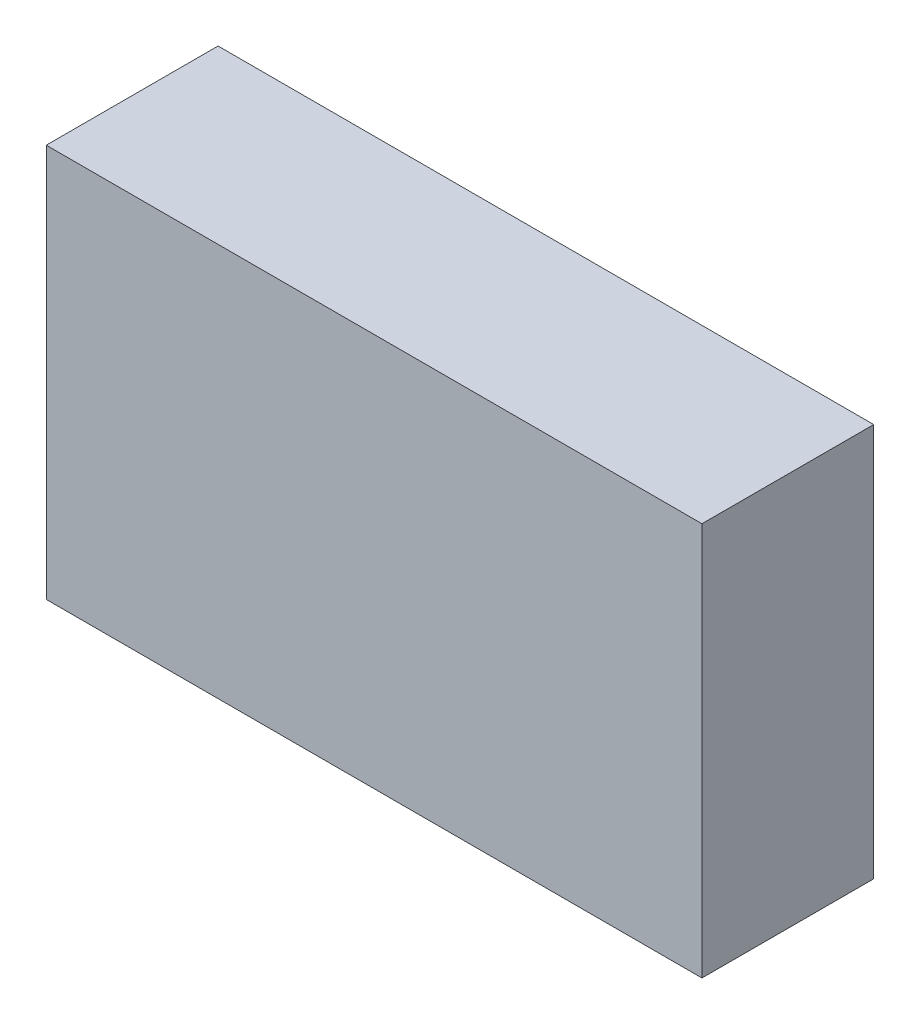
ISO-10303-21;
HEADER;
FILE_DESCRIPTION(('STEP AP214'),'2;1');
FILE_NAME('part.step','',(''),(''),'','','');
FILE_SCHEMA(('AUTOMOTIVE_DESIGN { 1 0 10303 214 1 1 1 1 }'));
ENDSEC;
DATA;
#1=APPLICATION_CONTEXT('core data for automotive mechanical design processes');
#2=APPLICATION_PROTOCOL_DEFINITION('international standard','automotive_design',2000,#1);
#3=PRODUCT_CONTEXT('',#1,'mechanical');
#4=PRODUCT('Part','Part','',(#3));
#5=PRODUCT_RELATED_PRODUCT_CATEGORY('part','',(#4));
#6=PRODUCT_DEFINITION_FORMATION('','',#4);
#7=PRODUCT_DEFINITION_CONTEXT('part definition',#1,'design');
#8=PRODUCT_DEFINITION('design','',#6,#7);
#9=PRODUCT_DEFINITION_SHAPE('','',#8);
#10=(LENGTH_UNIT() NAMED_UNIT(*) SI_UNIT(.MILLI.,.METRE.));
#11=(NAMED_UNIT(*) PLANE_ANGLE_UNIT() SI_UNIT($,.RADIAN.));
#12=(NAMED_UNIT(*) SI_UNIT($,.STERADIAN.) SOLID_ANGLE_UNIT());
#13=UNCERTAINTY_MEASURE_WITH_UNIT(LENGTH_MEASURE(1.E-05),#10,'distance_accuracy_value','');
#14=(GEOMETRIC_REPRESENTATION_CONTEXT(3) GLOBAL_UNCERTAINTY_ASSIGNED_CONTEXT((#13)) GLOBAL_UNIT_ASSIGNED_CONTEXT((#10,
#11,#12)) REPRESENTATION_CONTEXT('',''));
#15=CARTESIAN_POINT('',(0.,0.,0.));
#16=DIRECTION('',(0.,0.,1.));
#17=DIRECTION('',(1.,0.,0.));
#18=AXIS2_PLACEMENT_3D('',#15,#16,#17);
#19=CARTESIAN_POINT('',(75.,45.,39.3));
#20=DIRECTION('',(-1.,0.,0.));
#21=DIRECTION('',(0.,0.,1.));
#22=AXIS2_PLACEMENT_3D('',#19,#20,#21);
#23=PLANE('',#22);
#24=DIRECTION('',(0.,1.,0.));
#25=VECTOR('',#24,1.);
#26=CARTESIAN_POINT('',(75.,45.,0.));
#27=LINE('',#26,#25);
#28=CARTESIAN_POINT('',(75.,-45.,0.));
#29=VERTEX_POINT('',#28);
#30=CARTESIAN_POINT('',(75.,45.,0.));
#31=VERTEX_POINT('',#30);
#32=EDGE_CURVE('E102',#29,#31,#27,.T.);
#33=ORIENTED_EDGE('',*,*,#32,.T.);
#34=DIRECTION('',(0.,0.,-1.));
#35=VECTOR('',#34,1.);
#36=CARTESIAN_POINT('',(75.,45.,39.3));
#37=LINE('',#36,#35);
#38=CARTESIAN_POINT('',(75.,45.,39.3));
#39=VERTEX_POINT('',#38);
#40=EDGE_CURVE('E11',#39,#31,#37,.T.);
#41=ORIENTED_EDGE('',*,*,#40,.F.);
#42=DIRECTION('',(0.,1.,0.));
#43=VECTOR('',#42,1.);
#44=CARTESIAN_POINT('',(75.,45.,39.3));
#45=LINE('',#44,#43);
#46=CARTESIAN_POINT('',(75.,-45.,39.3));
#47=VERTEX_POINT('',#46);
#48=EDGE_CURVE('E90',#47,#39,#45,.T.);
#49=ORIENTED_EDGE('',*,*,#48,.F.);
#50=DIRECTION('',(0.,0.,-1.));
#51=VECTOR('',#50,1.);
#52=CARTESIAN_POINT('',(75.,-45.,39.3));
#53=LINE('',#52,#51);
#54=EDGE_CURVE('E98',#47,#29,#53,.T.);
#55=ORIENTED_EDGE('',*,*,#54,.T.);
#56=EDGE_LOOP('',(#33,#41,#49,#55));
#57=FACE_BOUND('',#56,.T.);
#58=ADVANCED_FACE('F39',(#57),#23,.F.);
#59=CARTESIAN_POINT('',(-75.,45.,39.3));
#60=DIRECTION('',(0.,-1.,0.));
#61=DIRECTION('',(0.,0.,-1.));
#62=AXIS2_PLACEMENT_3D('',#59,#60,#61);
#63=PLANE('',#62);
#64=DIRECTION('',(-1.,0.,0.));
#65=VECTOR('',#64,1.);
#66=CARTESIAN_POINT('',(-75.,45.,0.));
#67=LINE('',#66,#65);
#68=CARTESIAN_POINT('',(-75.,45.,0.));
#69=VERTEX_POINT('',#68);
#70=EDGE_CURVE('E94',#31,#69,#67,.T.);
#71=ORIENTED_EDGE('',*,*,#70,.T.);
#72=DIRECTION('',(0.,0.,-1.));
#73=VECTOR('',#72,1.);
#74=CARTESIAN_POINT('',(-75.,45.,39.3));
#75=LINE('',#74,#73);
#76=CARTESIAN_POINT('',(-75.,45.,39.3));
#77=VERTEX_POINT('',#76);
#78=EDGE_CURVE('E47',#77,#69,#75,.T.);
#79=ORIENTED_EDGE('',*,*,#78,.F.);
#80=DIRECTION('',(-1.,0.,0.));
#81=VECTOR('',#80,1.);
#82=CARTESIAN_POINT('',(-75.,45.,39.3));
#83=LINE('',#82,#81);
#84=EDGE_CURVE('E85',#39,#77,#83,.T.);
#85=ORIENTED_EDGE('',*,*,#84,.F.);
#86=ORIENTED_EDGE('',*,*,#40,.T.);
#87=EDGE_LOOP('',(#71,#79,#85,#86));
#88=FACE_BOUND('',#87,.T.);
#89=ADVANCED_FACE('F93',(#88),#63,.F.);
#90=CARTESIAN_POINT('',(-75.,45.,39.3));
#91=DIRECTION('',(1.,0.,0.));
#92=DIRECTION('',(0.,1.,0.));
#93=AXIS2_PLACEMENT_3D('',#90,#91,#92);
#94=PLANE('',#93);
#95=DIRECTION('',(0.,-1.,0.));
#96=VECTOR('',#95,1.);
#97=CARTESIAN_POINT('',(-75.,45.,0.));
#98=LINE('',#97,#96);
#99=CARTESIAN_POINT('',(-75.,-45.,0.));
#100=VERTEX_POINT('',#99);
#101=EDGE_CURVE('E72',#69,#100,#98,.T.);
#102=ORIENTED_EDGE('',*,*,#101,.T.);
#103=DIRECTION('',(0.,0.,-1.));
#104=VECTOR('',#103,1.);
#105=CARTESIAN_POINT('',(-75.,-45.,39.3));
#106=LINE('',#105,#104);
#107=CARTESIAN_POINT('',(-75.,-45.,39.3));
#108=VERTEX_POINT('',#107);
#109=EDGE_CURVE('E95',#108,#100,#106,.T.);
#110=ORIENTED_EDGE('',*,*,#109,.F.);
#111=DIRECTION('',(0.,-1.,0.));
#112=VECTOR('',#111,1.);
#113=CARTESIAN_POINT('',(-75.,45.,39.3));
#114=LINE('',#113,#112);
#115=EDGE_CURVE('E88',#77,#108,#114,.T.);
#116=ORIENTED_EDGE('',*,*,#115,.F.);
#117=ORIENTED_EDGE('',*,*,#78,.T.);
#118=EDGE_LOOP('',(#102,#110,#116,#117));
#119=FACE_BOUND('',#118,.T.);
#120=ADVANCED_FACE('F96',(#119),#94,.F.);
#121=CARTESIAN_POINT('',(-75.,-45.,39.3));
#122=DIRECTION('',(0.,1.,0.));
#123=DIRECTION('',(0.,0.,1.));
#124=AXIS2_PLACEMENT_3D('',#121,#122,#123);
#125=PLANE('',#124);
#126=DIRECTION('',(1.,0.,0.));
#127=VECTOR('',#126,1.);
#128=CARTESIAN_POINT('',(-75.,-45.,0.));
#129=LINE('',#128,#127);
#130=EDGE_CURVE('E78',#100,#29,#129,.T.);
#131=ORIENTED_EDGE('',*,*,#130,.T.);
#132=ORIENTED_EDGE('',*,*,#54,.F.);
#133=DIRECTION('',(1.,0.,0.));
#134=VECTOR('',#133,1.);
#135=CARTESIAN_POINT('',(-75.,-45.,39.3));
#136=LINE('',#135,#134);
#137=EDGE_CURVE('E55',#108,#47,#136,.T.);
#138=ORIENTED_EDGE('',*,*,#137,.F.);
#139=ORIENTED_EDGE('',*,*,#109,.T.);
#140=EDGE_LOOP('',(#131,#132,#138,#139));
#141=FACE_BOUND('',#140,.T.);
#142=ADVANCED_FACE('F109',(#141),#125,.F.);
#143=CARTESIAN_POINT('',(0.,0.,39.3));
#144=DIRECTION('',(0.,0.,1.));
#145=DIRECTION('',(1.,0.,0.));
#146=AXIS2_PLACEMENT_3D('',#143,#144,#145);
#147=PLANE('',#146);
#148=ORIENTED_EDGE('',*,*,#48,.T.);
#149=ORIENTED_EDGE('',*,*,#84,.T.);
#150=ORIENTED_EDGE('',*,*,#115,.T.);
#151=ORIENTED_EDGE('',*,*,#137,.T.);
#152=EDGE_LOOP('',(#148,#149,#150,#151));
#153=FACE_BOUND('',#152,.T.);
#154=ADVANCED_FACE('F86',(#153),#147,.T.);
#155=CARTESIAN_POINT('',(0.,0.,0.));
#156=DIRECTION('',(0.,0.,1.));
#157=DIRECTION('',(1.,0.,0.));
#158=AXIS2_PLACEMENT_3D('',#155,#156,#157);
#159=PLANE('',#158);
#160=ORIENTED_EDGE('',*,*,#32,.F.);
#161=ORIENTED_EDGE('',*,*,#130,.F.);
#162=ORIENTED_EDGE('',*,*,#101,.F.);
#163=ORIENTED_EDGE('',*,*,#70,.F.);
#164=EDGE_LOOP('',(#160,#161,#162,#163));
#165=FACE_BOUND('',#164,.T.);
#166=ADVANCED_FACE('F112',(#165),#159,.F.);
#167=CLOSED_SHELL('',(#58,#89,#120,#142,#154,#166));
#168=MANIFOLD_SOLID_BREP('B2',#167);
#169=ADVANCED_BREP_SHAPE_REPRESENTATION('',(#18,#168),#14);
#170=SHAPE_DEFINITION_REPRESENTATION(#9,#169);
ENDSEC;
END-ISO-10303-21;
